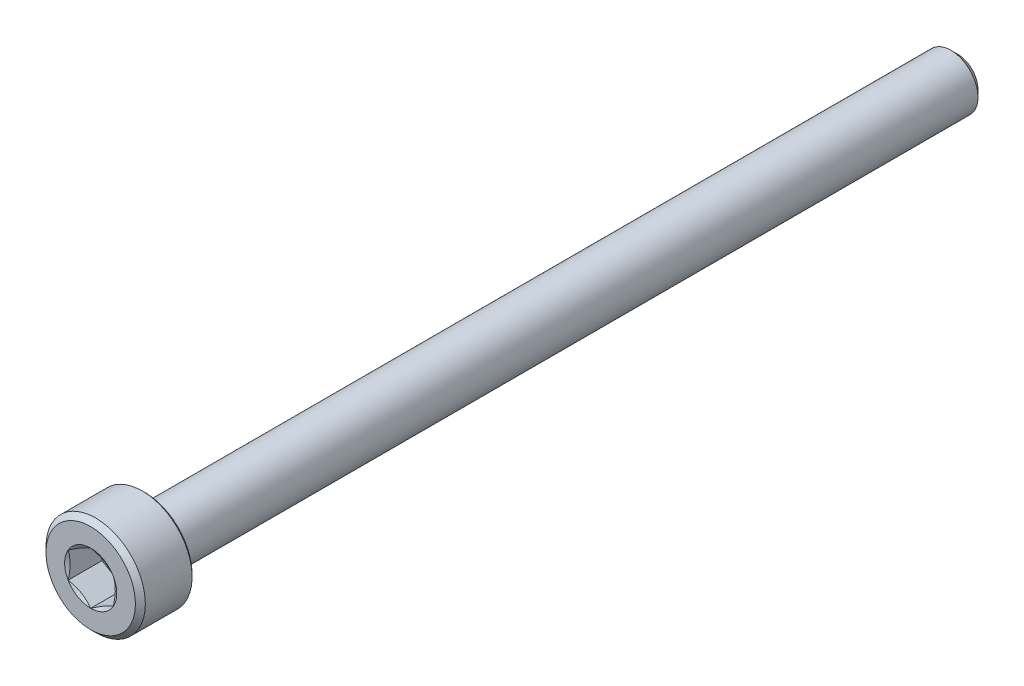
ISO-10303-21;
HEADER;
FILE_DESCRIPTION(('STEP AP214'),'2;1');
FILE_NAME('part.step','',(''),(''),'','','');
FILE_SCHEMA(('AUTOMOTIVE_DESIGN { 1 0 10303 214 1 1 1 1 }'));
ENDSEC;
DATA;
#1=APPLICATION_CONTEXT('core data for automotive mechanical design processes');
#2=APPLICATION_PROTOCOL_DEFINITION('international standard','automotive_design',2000,#1);
#3=PRODUCT_CONTEXT('',#1,'mechanical');
#4=PRODUCT('Part','Part','',(#3));
#5=PRODUCT_RELATED_PRODUCT_CATEGORY('part','',(#4));
#6=PRODUCT_DEFINITION_FORMATION('','',#4);
#7=PRODUCT_DEFINITION_CONTEXT('part definition',#1,'design');
#8=PRODUCT_DEFINITION('design','',#6,#7);
#9=PRODUCT_DEFINITION_SHAPE('','',#8);
#10=(LENGTH_UNIT() NAMED_UNIT(*) SI_UNIT(.MILLI.,.METRE.));
#11=(NAMED_UNIT(*) PLANE_ANGLE_UNIT() SI_UNIT($,.RADIAN.));
#12=(NAMED_UNIT(*) SI_UNIT($,.STERADIAN.) SOLID_ANGLE_UNIT());
#13=UNCERTAINTY_MEASURE_WITH_UNIT(LENGTH_MEASURE(1.E-05),#10,'distance_accuracy_value','');
#14=(GEOMETRIC_REPRESENTATION_CONTEXT(3) GLOBAL_UNCERTAINTY_ASSIGNED_CONTEXT((#13)) GLOBAL_UNIT_ASSIGNED_CONTEXT((#10,
#11,#12)) REPRESENTATION_CONTEXT('',''));
#15=CARTESIAN_POINT('',(0.,0.,0.));
#16=DIRECTION('',(0.,0.,1.));
#17=DIRECTION('',(1.,0.,0.));
#18=AXIS2_PLACEMENT_3D('',#15,#16,#17);
#19=CARTESIAN_POINT('',(-2.61249999999999,0.,21.));
#20=DIRECTION('',(0.,0.,-1.));
#21=DIRECTION('',(-1.,0.,0.));
#22=AXIS2_PLACEMENT_3D('',#19,#20,#21);
#23=PLANE('',#22);
#24=CARTESIAN_POINT('',(0.,0.,21.));
#25=DIRECTION('',(0.,0.,-1.));
#26=DIRECTION('',(-1.,0.,0.));
#27=AXIS2_PLACEMENT_3D('',#24,#25,#26);
#28=CIRCLE('',#27,1.5);
#29=CARTESIAN_POINT('',(-1.5,0.,21.));
#30=VERTEX_POINT('',#29);
#31=EDGE_CURVE('E12',#30,#30,#28,.T.);
#32=ORIENTED_EDGE('',*,*,#31,.F.);
#33=EDGE_LOOP('',(#32));
#34=FACE_BOUND('',#33,.T.);
#35=CARTESIAN_POINT('',(0.,0.,21.));
#36=DIRECTION('',(0.,0.,-1.));
#37=DIRECTION('',(-1.,0.,0.));
#38=AXIS2_PLACEMENT_3D('',#35,#36,#37);
#39=CIRCLE('',#38,2.61249999999999);
#40=CARTESIAN_POINT('',(-2.61249999999999,0.,21.));
#41=VERTEX_POINT('',#40);
#42=EDGE_CURVE('E260',#41,#41,#39,.T.);
#43=ORIENTED_EDGE('',*,*,#42,.T.);
#44=EDGE_LOOP('',(#43));
#45=FACE_BOUND('',#44,.T.);
#46=ADVANCED_FACE('F42',(#34,#45),#23,.T.);
#47=CARTESIAN_POINT('',(0.,0.,22.125));
#48=DIRECTION('',(0.,0.,1.));
#49=DIRECTION('',(1.,0.,0.));
#50=AXIS2_PLACEMENT_3D('',#47,#48,#49);
#51=PLANE('',#50);
#52=DIRECTION('',(-0.866025403784439,0.5,0.));
#53=VECTOR('',#52,1.);
#54=CARTESIAN_POINT('',(1.25,0.721687836487031,22.125));
#55=LINE('',#54,#53);
#56=CARTESIAN_POINT('',(1.25,0.721687836487031,22.125));
#57=VERTEX_POINT('',#56);
#58=CARTESIAN_POINT('',(0.,1.44337567297406,22.125));
#59=VERTEX_POINT('',#58);
#60=EDGE_CURVE('E108',#57,#59,#55,.T.);
#61=ORIENTED_EDGE('',*,*,#60,.T.);
#62=DIRECTION('',(-0.866025403784438,-0.5,0.));
#63=VECTOR('',#62,1.);
#64=CARTESIAN_POINT('',(0.,1.44337567297406,22.125));
#65=LINE('',#64,#63);
#66=CARTESIAN_POINT('',(-1.25,0.72168783648703,22.125));
#67=VERTEX_POINT('',#66);
#68=EDGE_CURVE('E227',#59,#67,#65,.T.);
#69=ORIENTED_EDGE('',*,*,#68,.T.);
#70=DIRECTION('',(0.,-1.,0.));
#71=VECTOR('',#70,1.);
#72=CARTESIAN_POINT('',(-1.25,0.72168783648703,22.125));
#73=LINE('',#72,#71);
#74=CARTESIAN_POINT('',(-1.25,-0.721687836487034,22.125));
#75=VERTEX_POINT('',#74);
#76=EDGE_CURVE('E230',#67,#75,#73,.T.);
#77=ORIENTED_EDGE('',*,*,#76,.T.);
#78=DIRECTION('',(0.866025403784439,-0.5,0.));
#79=VECTOR('',#78,1.);
#80=CARTESIAN_POINT('',(-1.25,-0.721687836487034,22.125));
#81=LINE('',#80,#79);
#82=CARTESIAN_POINT('',(0.,-1.44337567297407,22.125));
#83=VERTEX_POINT('',#82);
#84=EDGE_CURVE('E231',#75,#83,#81,.T.);
#85=ORIENTED_EDGE('',*,*,#84,.T.);
#86=DIRECTION('',(0.866025403784439,0.5,0.));
#87=VECTOR('',#86,1.);
#88=CARTESIAN_POINT('',(0.,-1.44337567297407,22.125));
#89=LINE('',#88,#87);
#90=CARTESIAN_POINT('',(1.25,-0.721687836487034,22.125));
#91=VERTEX_POINT('',#90);
#92=EDGE_CURVE('E236',#83,#91,#89,.T.);
#93=ORIENTED_EDGE('',*,*,#92,.T.);
#94=DIRECTION('',(0.,1.,0.));
#95=VECTOR('',#94,1.);
#96=CARTESIAN_POINT('',(1.25,-0.721687836487034,22.125));
#97=LINE('',#96,#95);
#98=EDGE_CURVE('E229',#91,#57,#97,.T.);
#99=ORIENTED_EDGE('',*,*,#98,.T.);
#100=EDGE_LOOP('',(#61,#69,#77,#85,#93,#99));
#101=FACE_BOUND('',#100,.T.);
#102=ADVANCED_FACE('F216',(#101),#51,.T.);
#103=CARTESIAN_POINT('',(0.,1.44337567297406,22.125));
#104=DIRECTION('',(-0.5,0.866025403784438,0.));
#105=DIRECTION('',(-0.866025403784439,-0.5,0.));
#106=AXIS2_PLACEMENT_3D('',#103,#104,#105);
#107=PLANE('',#106);
#108=DIRECTION('',(0.,0.,1.));
#109=VECTOR('',#108,1.);
#110=CARTESIAN_POINT('',(0.,1.44337567297406,22.125));
#111=LINE('',#110,#109);
#112=CARTESIAN_POINT('',(0.,1.44337567297406,24.));
#113=VERTEX_POINT('',#112);
#114=EDGE_CURVE('E64',#59,#113,#111,.T.);
#115=ORIENTED_EDGE('',*,*,#114,.T.);
#116=CARTESIAN_POINT('',(0.000199999999999545,1.4434911430279,24.000066674666));
#117=CARTESIAN_POINT('',(-0.0547333052317655,1.41177538446486,23.9817459147637));
#118=CARTESIAN_POINT('',(-0.11014078650024,1.37978586023939,23.9650833062006));
#119=CARTESIAN_POINT('',(-0.22191536760034,1.31525277575269,23.9359973039458));
#120=CARTESIAN_POINT('',(-0.278284454841711,1.28270806805991,23.9235842019761));
#121=CARTESIAN_POINT('',(-0.390323974086985,1.21802202146378,23.904259687636));
#122=CARTESIAN_POINT('',(-0.44597715845923,1.1858906404852,23.8972196894474));
#123=CARTESIAN_POINT('',(-0.557545653908392,1.12147653960455,23.8888124326306));
#124=CARTESIAN_POINT('',(-0.613460558937601,1.08919405413422,23.8874382152047));
#125=CARTESIAN_POINT('',(-0.717957921181725,1.02886247391297,23.8902833373679));
#126=CARTESIAN_POINT('',(-0.766555949881316,1.00080438896118,23.89380409882));
#127=CARTESIAN_POINT('',(-0.863435362173238,0.944871034195501,23.9049671126993));
#128=CARTESIAN_POINT('',(-0.911716410192163,0.916995958125018,23.9126131855727));
#129=CARTESIAN_POINT('',(-1.00879588385404,0.860947097873544,23.9317294547005));
#130=CARTESIAN_POINT('',(-1.0575820103519,0.832780414607287,23.9432807569797));
#131=CARTESIAN_POINT('',(-1.1544262522921,0.776867365453646,23.9694983146939));
#132=CARTESIAN_POINT('',(-1.20248561032696,0.749120282155138,23.9841584021391));
#133=CARTESIAN_POINT('',(-1.2502,0.721572366433192,24.000066674666));
#134=B_SPLINE_CURVE_WITH_KNOTS('',3,(#116,#117,#118,#119,#120,#121,#122,#123,#124,#125,#126,
#127,#128,#129,#130,#131,#132,#133),.UNSPECIFIED.,.F.,.F.,(4,2,2,2,2,2,2,2,4),(0.,
0.198150821029559,0.396778196315221,0.5904886173544,0.783961049317182,0.952480056398646,
1.1211553973001,1.2935743034359,1.4656542697693),.UNSPECIFIED.);
#135=CARTESIAN_POINT('',(-1.25,0.721687836487032,24.));
#136=VERTEX_POINT('',#135);
#137=EDGE_CURVE('E121',#113,#136,#134,.T.);
#138=ORIENTED_EDGE('',*,*,#137,.T.);
#139=DIRECTION('',(0.,0.,1.));
#140=VECTOR('',#139,1.);
#141=CARTESIAN_POINT('',(-1.25,0.72168783648703,22.125));
#142=LINE('',#141,#140);
#143=EDGE_CURVE('E245',#67,#136,#142,.T.);
#144=ORIENTED_EDGE('',*,*,#143,.F.);
#145=ORIENTED_EDGE('',*,*,#68,.F.);
#146=EDGE_LOOP('',(#115,#138,#144,#145));
#147=FACE_BOUND('',#146,.T.);
#148=ADVANCED_FACE('F155',(#147),#107,.F.);
#149=CARTESIAN_POINT('',(-1.25,0.72168783648703,22.125));
#150=DIRECTION('',(-1.,0.,0.));
#151=DIRECTION('',(0.,-1.,0.));
#152=AXIS2_PLACEMENT_3D('',#149,#150,#151);
#153=PLANE('',#152);
#154=ORIENTED_EDGE('',*,*,#143,.T.);
#155=CARTESIAN_POINT('',(-1.25,-1.86893140179217,24.4647941109243));
#156=CARTESIAN_POINT('',(-1.25,-1.81495202267025,24.4388968384665));
#157=CARTESIAN_POINT('',(-1.25,-1.76084125344196,24.4132686219312));
#158=CARTESIAN_POINT('',(-1.25,-1.65228662652066,24.3627027606134));
#159=CARTESIAN_POINT('',(-1.25,-1.59784271100767,24.3377652401103));
#160=CARTESIAN_POINT('',(-1.25,-1.48823931692675,24.2885939163498));
#161=CARTESIAN_POINT('',(-1.25,-1.43307750108907,24.2643652994868));
#162=CARTESIAN_POINT('',(-1.25,-1.32229188443621,24.2169950705039));
#163=CARTESIAN_POINT('',(-1.25,-1.26666810781962,24.1938534018645));
#164=CARTESIAN_POINT('',(-1.25,-1.15340083047608,24.1483546130678));
#165=CARTESIAN_POINT('',(-1.25,-1.09574254265115,24.1260338154653));
#166=CARTESIAN_POINT('',(-1.25,-0.979741082890175,24.083255476912));
#167=CARTESIAN_POINT('',(-1.25,-0.921397826164639,24.0627981694397));
#168=CARTESIAN_POINT('',(-1.25,-0.745435524772241,24.0050842376762));
#169=CARTESIAN_POINT('',(-1.25,-0.626561938132861,23.9713502149769));
#170=CARTESIAN_POINT('',(-1.25,-0.445873083681239,23.9322204068282));
#171=CARTESIAN_POINT('',(-1.25,-0.385304700192768,23.9210940606189));
#172=CARTESIAN_POINT('',(-1.25,-0.26348659206503,23.9034278522676));
#173=CARTESIAN_POINT('',(-1.25,-0.202236913753247,23.8968876801832));
#174=CARTESIAN_POINT('',(-1.25,-0.0801324468775848,23.8889987810428));
#175=CARTESIAN_POINT('',(-1.25,-0.0192817197887167,23.8875887912582));
#176=CARTESIAN_POINT('',(-1.25,0.102319232701152,23.8899161878862));
#177=CARTESIAN_POINT('',(-1.25,0.163069451645859,23.893653893026));
#178=CARTESIAN_POINT('',(-1.25,0.312961598922923,23.9088980280361));
#179=CARTESIAN_POINT('',(-1.25,0.401813055628259,23.9232612484297));
#180=CARTESIAN_POINT('',(-1.25,0.577788146583198,23.9602998495149));
#181=CARTESIAN_POINT('',(-1.25,0.664909564430747,23.9829852483541));
#182=CARTESIAN_POINT('',(-1.25,0.795209224728791,24.0217374532821));
#183=CARTESIAN_POINT('',(-1.25,0.839061001813533,24.0356229448103));
#184=CARTESIAN_POINT('',(-1.25,0.926308087473953,24.0646784153621));
#185=CARTESIAN_POINT('',(-1.25,0.969703662172459,24.0798475927664));
#186=CARTESIAN_POINT('',(-1.25,1.05609633508794,24.1112501339966));
#187=CARTESIAN_POINT('',(-1.25,1.09909350410933,24.127483304423));
#188=CARTESIAN_POINT('',(-1.25,1.18474903910479,24.1608382439108));
#189=CARTESIAN_POINT('',(-1.25,1.22740734642399,24.1779601631043));
#190=CARTESIAN_POINT('',(-1.25,1.33629459550825,24.2227614292321));
#191=CARTESIAN_POINT('',(-1.25,1.40230581092028,24.2509693835735));
#192=CARTESIAN_POINT('',(-1.25,1.53373213594212,24.3087450811585));
#193=CARTESIAN_POINT('',(-1.25,1.59914720045374,24.3383129262699));
#194=CARTESIAN_POINT('',(-1.25,1.79469680395942,24.4285769200244));
#195=CARTESIAN_POINT('',(-1.25,1.92411390982368,24.4908242731852));
#196=CARTESIAN_POINT('',(-1.25,2.18184246876936,24.6179296229027));
#197=CARTESIAN_POINT('',(-1.25,2.31015236703661,24.682790734765));
#198=CARTESIAN_POINT('',(-1.25,2.56589305685455,24.8141807455314));
#199=CARTESIAN_POINT('',(-1.25,2.69332395754888,24.8807094324427));
#200=CARTESIAN_POINT('',(-1.25,2.93557826301822,25.0085820016458));
#201=CARTESIAN_POINT('',(-1.25,3.05045639113076,25.0698225704122));
#202=CARTESIAN_POINT('',(-1.25,3.27984311898855,25.1930014800409));
#203=CARTESIAN_POINT('',(-1.25,3.39435170485538,25.2549398467261));
#204=CARTESIAN_POINT('',(-1.25,3.62279327872168,25.3791811560561));
#205=CARTESIAN_POINT('',(-1.25,3.73672698995313,25.441482770676));
#206=CARTESIAN_POINT('',(-1.25,3.96436406629495,25.5664914919315));
#207=CARTESIAN_POINT('',(-1.25,4.07806744314788,25.6291985771761));
#208=CARTESIAN_POINT('',(-1.25,4.19168806612954,25.6920543493623));
#209=B_SPLINE_CURVE_WITH_KNOTS('',3,(#155,#156,#157,#158,#159,#160,#161,#162,#163,#164,#165,
#166,#167,#168,#169,#170,#171,#172,#173,#174,#175,#176,#177,#178,#179,#180,#181,#182,#183,#184,
#185,#186,#187,#188,#189,#190,#191,#192,#193,#194,#195,#196,#197,#198,#199,#200,#201,#202,#203,
#204,#205,#206,#207,#208),.UNSPECIFIED.,.F.,.F.,(4,2,2,2,2,2,2,2,2,2,2,2,2,2,2,2,2,2,2,2,2,2,2,
2,2,2,4),(0.,0.179612926712514,0.359257964580623,0.539992735616906,0.720718098311213,
0.906167781883877,1.09164066876278,1.4615401462125,1.64614554413147,1.83073846485712,
2.0131196740194,2.19551217609307,2.46497297688035,2.73475922178117,2.87273702323329,
3.01062928909397,3.14849655975686,3.28638719597089,3.50172172546908,3.7170724117864,
4.14784491349865,4.57914698286382,5.01039449766869,5.40093821140478,5.79149642546539,
6.18106124184771,6.57060567131893),.UNSPECIFIED.);
#210=CARTESIAN_POINT('',(-1.25,-0.721687836487033,24.));
#211=VERTEX_POINT('',#210);
#212=EDGE_CURVE('E128',#136,#211,#209,.F.);
#213=ORIENTED_EDGE('',*,*,#212,.T.);
#214=DIRECTION('',(0.,0.,1.));
#215=VECTOR('',#214,1.);
#216=CARTESIAN_POINT('',(-1.25,-0.721687836487034,22.125));
#217=LINE('',#216,#215);
#218=EDGE_CURVE('E243',#75,#211,#217,.T.);
#219=ORIENTED_EDGE('',*,*,#218,.F.);
#220=ORIENTED_EDGE('',*,*,#76,.F.);
#221=EDGE_LOOP('',(#154,#213,#219,#220));
#222=FACE_BOUND('',#221,.T.);
#223=ADVANCED_FACE('F150',(#222),#153,.F.);
#224=CARTESIAN_POINT('',(-1.25,-0.721687836487034,22.125));
#225=DIRECTION('',(-0.5,-0.866025403784439,0.));
#226=DIRECTION('',(0.866025403784439,-0.5,0.));
#227=AXIS2_PLACEMENT_3D('',#224,#225,#226);
#228=PLANE('',#227);
#229=ORIENTED_EDGE('',*,*,#218,.T.);
#230=CARTESIAN_POINT('',(-1.2502,-0.721572366433196,24.000066674666));
#231=CARTESIAN_POINT('',(-1.19526669476823,-0.753288124996232,23.9817459147637));
#232=CARTESIAN_POINT('',(-1.13985921349976,-0.785277649221705,23.9650833062006));
#233=CARTESIAN_POINT('',(-1.02808463239966,-0.849810733708405,23.9359973039458));
#234=CARTESIAN_POINT('',(-0.971715545158289,-0.882355441401184,23.923584201976));
#235=CARTESIAN_POINT('',(-0.859676025913015,-0.94704148799732,23.904259687636));
#236=CARTESIAN_POINT('',(-0.804022841540769,-0.979172868975895,23.8972196894474));
#237=CARTESIAN_POINT('',(-0.692454346091607,-1.04358696985655,23.8888124326306));
#238=CARTESIAN_POINT('',(-0.636539441062399,-1.07586945532688,23.8874382152047));
#239=CARTESIAN_POINT('',(-0.532042078818274,-1.13620103554813,23.8902833373679));
#240=CARTESIAN_POINT('',(-0.483444050118683,-1.16425912049992,23.89380409882));
#241=CARTESIAN_POINT('',(-0.386564637826761,-1.2201924752656,23.9049671126993));
#242=CARTESIAN_POINT('',(-0.338283589807836,-1.24806755133608,23.9126131855727));
#243=CARTESIAN_POINT('',(-0.241204116145956,-1.30411641158755,23.9317294547005));
#244=CARTESIAN_POINT('',(-0.192417989648099,-1.33228309485381,23.9432807569797));
#245=CARTESIAN_POINT('',(-0.0955737477078969,-1.38819614400745,23.9694983146939));
#246=CARTESIAN_POINT('',(-0.0475143896730349,-1.41594322730596,23.9841584021391));
#247=CARTESIAN_POINT('',(0.000200000000000781,-1.4434911430279,24.000066674666));
#248=B_SPLINE_CURVE_WITH_KNOTS('',3,(#230,#231,#232,#233,#234,#235,#236,#237,#238,#239,#240,
#241,#242,#243,#244,#245,#246,#247),.UNSPECIFIED.,.F.,.F.,(4,2,2,2,2,2,2,2,4),(0.,
0.198150821029561,0.396778196315222,0.590488617354401,0.783961049317183,0.952480056398648,
1.1211553973001,1.2935743034359,1.4656542697693),.UNSPECIFIED.);
#249=CARTESIAN_POINT('',(0.,-1.44337567297407,24.));
#250=VERTEX_POINT('',#249);
#251=EDGE_CURVE('E131',#211,#250,#248,.T.);
#252=ORIENTED_EDGE('',*,*,#251,.T.);
#253=DIRECTION('',(0.,0.,1.));
#254=VECTOR('',#253,1.);
#255=CARTESIAN_POINT('',(0.,-1.44337567297407,22.125));
#256=LINE('',#255,#254);
#257=EDGE_CURVE('E240',#83,#250,#256,.T.);
#258=ORIENTED_EDGE('',*,*,#257,.F.);
#259=ORIENTED_EDGE('',*,*,#84,.F.);
#260=EDGE_LOOP('',(#229,#252,#258,#259));
#261=FACE_BOUND('',#260,.T.);
#262=ADVANCED_FACE('F154',(#261),#228,.F.);
#263=CARTESIAN_POINT('',(0.,-1.44337567297407,22.125));
#264=DIRECTION('',(0.5,-0.866025403784439,0.));
#265=DIRECTION('',(0.866025403784439,0.5,0.));
#266=AXIS2_PLACEMENT_3D('',#263,#264,#265);
#267=PLANE('',#266);
#268=ORIENTED_EDGE('',*,*,#257,.T.);
#269=CARTESIAN_POINT('',(-0.000199999999999969,-1.4434911430279,24.000066674666));
#270=CARTESIAN_POINT('',(0.0547333052317651,-1.41177538446487,23.9817459147637));
#271=CARTESIAN_POINT('',(0.11014078650024,-1.3797858602394,23.9650833062006));
#272=CARTESIAN_POINT('',(0.22191536760034,-1.3152527757527,23.9359973039458));
#273=CARTESIAN_POINT('',(0.278284454841711,-1.28270806805992,23.923584201976));
#274=CARTESIAN_POINT('',(0.390323974086985,-1.21802202146378,23.904259687636));
#275=CARTESIAN_POINT('',(0.44597715845923,-1.18589064048521,23.8972196894474));
#276=CARTESIAN_POINT('',(0.557545653908392,-1.12147653960455,23.8888124326306));
#277=CARTESIAN_POINT('',(0.613460558937601,-1.08919405413422,23.8874382152047));
#278=CARTESIAN_POINT('',(0.717957921181726,-1.02886247391297,23.8902833373679));
#279=CARTESIAN_POINT('',(0.766555949881316,-1.00080438896118,23.89380409882));
#280=CARTESIAN_POINT('',(0.863435362173239,-0.944871034195505,23.9049671126993));
#281=CARTESIAN_POINT('',(0.911716410192163,-0.916995958125021,23.9126131855727));
#282=CARTESIAN_POINT('',(1.00879588385404,-0.860947097873548,23.9317294547005));
#283=CARTESIAN_POINT('',(1.0575820103519,-0.832780414607291,23.9432807569797));
#284=CARTESIAN_POINT('',(1.1544262522921,-0.77686736545365,23.9694983146939));
#285=CARTESIAN_POINT('',(1.20248561032696,-0.749120282155142,23.9841584021391));
#286=CARTESIAN_POINT('',(1.2502,-0.721572366433196,24.000066674666));
#287=B_SPLINE_CURVE_WITH_KNOTS('',3,(#269,#270,#271,#272,#273,#274,#275,#276,#277,#278,#279,
#280,#281,#282,#283,#284,#285,#286),.UNSPECIFIED.,.F.,.F.,(4,2,2,2,2,2,2,2,4),(0.,
0.19815082102956,0.396778196315222,0.590488617354401,0.783961049317183,0.952480056398647,
1.1211553973001,1.2935743034359,1.4656542697693),.UNSPECIFIED.);
#288=CARTESIAN_POINT('',(1.25,-0.721687836487034,24.));
#289=VERTEX_POINT('',#288);
#290=EDGE_CURVE('E116',#250,#289,#287,.T.);
#291=ORIENTED_EDGE('',*,*,#290,.T.);
#292=DIRECTION('',(0.,0.,1.));
#293=VECTOR('',#292,1.);
#294=CARTESIAN_POINT('',(1.25,-0.721687836487034,22.125));
#295=LINE('',#294,#293);
#296=EDGE_CURVE('E114',#91,#289,#295,.T.);
#297=ORIENTED_EDGE('',*,*,#296,.F.);
#298=ORIENTED_EDGE('',*,*,#92,.F.);
#299=EDGE_LOOP('',(#268,#291,#297,#298));
#300=FACE_BOUND('',#299,.T.);
#301=ADVANCED_FACE('F161',(#300),#267,.F.);
#302=CARTESIAN_POINT('',(1.25,-0.721687836487034,22.125));
#303=DIRECTION('',(1.,0.,0.));
#304=DIRECTION('',(0.,0.,-1.));
#305=AXIS2_PLACEMENT_3D('',#302,#303,#304);
#306=PLANE('',#305);
#307=ORIENTED_EDGE('',*,*,#296,.T.);
#308=CARTESIAN_POINT('',(1.25,-1.86893140179217,24.4647941109243));
#309=CARTESIAN_POINT('',(1.25,-1.81495202267025,24.4388968384665));
#310=CARTESIAN_POINT('',(1.25,-1.76084125344196,24.4132686219312));
#311=CARTESIAN_POINT('',(1.25,-1.65228662652066,24.3627027606134));
#312=CARTESIAN_POINT('',(1.25,-1.59784271100767,24.3377652401103));
#313=CARTESIAN_POINT('',(1.25,-1.48823931692675,24.2885939163498));
#314=CARTESIAN_POINT('',(1.25,-1.43307750108907,24.2643652994868));
#315=CARTESIAN_POINT('',(1.25,-1.32229188443621,24.2169950705039));
#316=CARTESIAN_POINT('',(1.25,-1.26666810781962,24.1938534018645));
#317=CARTESIAN_POINT('',(1.25,-1.15340083047608,24.1483546130678));
#318=CARTESIAN_POINT('',(1.25,-1.09574254265115,24.1260338154653));
#319=CARTESIAN_POINT('',(1.25,-0.979741082890175,24.083255476912));
#320=CARTESIAN_POINT('',(1.25,-0.921397826164639,24.0627981694397));
#321=CARTESIAN_POINT('',(1.25,-0.745435524772241,24.0050842376762));
#322=CARTESIAN_POINT('',(1.25,-0.626561938132861,23.9713502149769));
#323=CARTESIAN_POINT('',(1.25,-0.445873083681239,23.9322204068282));
#324=CARTESIAN_POINT('',(1.25,-0.385304700192768,23.9210940606189));
#325=CARTESIAN_POINT('',(1.25,-0.26348659206503,23.9034278522676));
#326=CARTESIAN_POINT('',(1.25,-0.202236913753247,23.8968876801832));
#327=CARTESIAN_POINT('',(1.25,-0.0801324468775847,23.8889987810428));
#328=CARTESIAN_POINT('',(1.25,-0.0192817197887163,23.8875887912582));
#329=CARTESIAN_POINT('',(1.25,0.102319232701152,23.8899161878862));
#330=CARTESIAN_POINT('',(1.25,0.16306945164586,23.893653893026));
#331=CARTESIAN_POINT('',(1.25,0.312961598922924,23.9088980280361));
#332=CARTESIAN_POINT('',(1.25,0.40181305562826,23.9232612484297));
#333=CARTESIAN_POINT('',(1.25,0.577788146583198,23.9602998495149));
#334=CARTESIAN_POINT('',(1.25,0.664909564430748,23.9829852483541));
#335=CARTESIAN_POINT('',(1.25,0.795209224728792,24.0217374532821));
#336=CARTESIAN_POINT('',(1.25,0.839061001813534,24.0356229448103));
#337=CARTESIAN_POINT('',(1.25,0.926308087473953,24.0646784153621));
#338=CARTESIAN_POINT('',(1.25,0.96970366217246,24.0798475927664));
#339=CARTESIAN_POINT('',(1.25,1.05609633508794,24.1112501339966));
#340=CARTESIAN_POINT('',(1.25,1.09909350410933,24.127483304423));
#341=CARTESIAN_POINT('',(1.25,1.1847490391048,24.1608382439108));
#342=CARTESIAN_POINT('',(1.25,1.22740734642399,24.1779601631043));
#343=CARTESIAN_POINT('',(1.25,1.33629459550825,24.2227614292321));
#344=CARTESIAN_POINT('',(1.25,1.40230581092028,24.2509693835735));
#345=CARTESIAN_POINT('',(1.25,1.53373213594212,24.3087450811585));
#346=CARTESIAN_POINT('',(1.25,1.59914720045374,24.3383129262699));
#347=CARTESIAN_POINT('',(1.25,1.79469680395942,24.4285769200244));
#348=CARTESIAN_POINT('',(1.25,1.92411390982368,24.4908242731852));
#349=CARTESIAN_POINT('',(1.25,2.18184246876936,24.6179296229027));
#350=CARTESIAN_POINT('',(1.25,2.31015236703661,24.682790734765));
#351=CARTESIAN_POINT('',(1.25,2.56589305685455,24.8141807455314));
#352=CARTESIAN_POINT('',(1.25,2.69332395754888,24.8807094324427));
#353=CARTESIAN_POINT('',(1.25,2.93557826301822,25.0085820016458));
#354=CARTESIAN_POINT('',(1.25,3.05045639113076,25.0698225704122));
#355=CARTESIAN_POINT('',(1.25,3.27984311898855,25.1930014800409));
#356=CARTESIAN_POINT('',(1.25,3.39435170485538,25.2549398467262));
#357=CARTESIAN_POINT('',(1.25,3.62279327872168,25.3791811560561));
#358=CARTESIAN_POINT('',(1.25,3.73672698995313,25.441482770676));
#359=CARTESIAN_POINT('',(1.25,3.96436406629495,25.5664914919315));
#360=CARTESIAN_POINT('',(1.25,4.07806744314788,25.6291985771761));
#361=CARTESIAN_POINT('',(1.25,4.19168806612954,25.6920543493623));
#362=B_SPLINE_CURVE_WITH_KNOTS('',3,(#308,#309,#310,#311,#312,#313,#314,#315,#316,#317,#318,
#319,#320,#321,#322,#323,#324,#325,#326,#327,#328,#329,#330,#331,#332,#333,#334,#335,#336,#337,
#338,#339,#340,#341,#342,#343,#344,#345,#346,#347,#348,#349,#350,#351,#352,#353,#354,#355,#356,
#357,#358,#359,#360,#361),.UNSPECIFIED.,.F.,.F.,(4,2,2,2,2,2,2,2,2,2,2,2,2,2,2,2,2,2,2,2,2,2,2,
2,2,2,4),(0.,0.179612926712516,0.359257964580625,0.539992735616909,0.720718098311215,
0.906167781883879,1.09164066876279,1.4615401462125,1.64614554413147,1.83073846485713,
2.01311967401941,2.19551217609307,2.46497297688035,2.73475922178117,2.87273702323329,
3.01062928909397,3.14849655975687,3.28638719597089,3.50172172546908,3.7170724117864,
4.14784491349865,4.57914698286382,5.01039449766869,5.40093821140478,5.79149642546539,
6.18106124184772,6.57060567131893),.UNSPECIFIED.);
#363=CARTESIAN_POINT('',(1.25,0.721687836487028,24.));
#364=VERTEX_POINT('',#363);
#365=EDGE_CURVE('E100',#289,#364,#362,.T.);
#366=ORIENTED_EDGE('',*,*,#365,.T.);
#367=DIRECTION('',(0.,0.,1.));
#368=VECTOR('',#367,1.);
#369=CARTESIAN_POINT('',(1.25,0.721687836487031,22.125));
#370=LINE('',#369,#368);
#371=EDGE_CURVE('E113',#57,#364,#370,.T.);
#372=ORIENTED_EDGE('',*,*,#371,.F.);
#373=ORIENTED_EDGE('',*,*,#98,.F.);
#374=EDGE_LOOP('',(#307,#366,#372,#373));
#375=FACE_BOUND('',#374,.T.);
#376=ADVANCED_FACE('F111',(#375),#306,.F.);
#377=CARTESIAN_POINT('',(1.25,0.721687836487031,22.125));
#378=DIRECTION('',(0.5,0.866025403784439,0.));
#379=DIRECTION('',(-0.866025403784439,0.5,0.));
#380=AXIS2_PLACEMENT_3D('',#377,#378,#379);
#381=PLANE('',#380);
#382=ORIENTED_EDGE('',*,*,#371,.T.);
#383=CARTESIAN_POINT('',(1.2502,0.721572366433193,24.000066674666));
#384=CARTESIAN_POINT('',(1.19526669476823,0.753288124996229,23.9817459147637));
#385=CARTESIAN_POINT('',(1.13985921349976,0.785277649221701,23.9650833062006));
#386=CARTESIAN_POINT('',(1.02808463239966,0.849810733708402,23.9359973039458));
#387=CARTESIAN_POINT('',(0.97171554515829,0.88235544140118,23.9235842019761));
#388=CARTESIAN_POINT('',(0.859676025913015,0.947041487997316,23.904259687636));
#389=CARTESIAN_POINT('',(0.80402284154077,0.979172868975891,23.8972196894474));
#390=CARTESIAN_POINT('',(0.692454346091608,1.04358696985655,23.8888124326306));
#391=CARTESIAN_POINT('',(0.636539441062399,1.07586945532687,23.8874382152047));
#392=CARTESIAN_POINT('',(0.532042078818275,1.13620103554812,23.8902833373679));
#393=CARTESIAN_POINT('',(0.483444050118684,1.16425912049992,23.89380409882));
#394=CARTESIAN_POINT('',(0.386564637826761,1.22019247526559,23.9049671126993));
#395=CARTESIAN_POINT('',(0.338283589807836,1.24806755133608,23.9126131855727));
#396=CARTESIAN_POINT('',(0.241204116145956,1.30411641158755,23.9317294547005));
#397=CARTESIAN_POINT('',(0.1924179896481,1.33228309485381,23.9432807569797));
#398=CARTESIAN_POINT('',(0.0955737477078973,1.38819614400745,23.9694983146939));
#399=CARTESIAN_POINT('',(0.0475143896730352,1.41594322730595,23.9841584021391));
#400=CARTESIAN_POINT('',(-0.00020000000000046,1.4434911430279,24.000066674666));
#401=B_SPLINE_CURVE_WITH_KNOTS('',3,(#383,#384,#385,#386,#387,#388,#389,#390,#391,#392,#393,
#394,#395,#396,#397,#398,#399,#400),.UNSPECIFIED.,.F.,.F.,(4,2,2,2,2,2,2,2,4),(0.,
0.198150821029558,0.39677819631522,0.5904886173544,0.783961049317182,0.952480056398646,
1.1211553973001,1.2935743034359,1.4656542697693),.UNSPECIFIED.);
#402=EDGE_CURVE('E105',#364,#113,#401,.T.);
#403=ORIENTED_EDGE('',*,*,#402,.T.);
#404=ORIENTED_EDGE('',*,*,#114,.F.);
#405=ORIENTED_EDGE('',*,*,#60,.F.);
#406=EDGE_LOOP('',(#382,#403,#404,#405));
#407=FACE_BOUND('',#406,.T.);
#408=ADVANCED_FACE('F118',(#407),#381,.F.);
#409=CARTESIAN_POINT('',(0.,0.,24.));
#410=DIRECTION('',(0.,0.,1.));
#411=DIRECTION('',(1.,0.,0.));
#412=AXIS2_PLACEMENT_3D('',#409,#410,#411);
#413=CONICAL_SURFACE('',#412,1.44337567297406,1.0471975511966);
#414=CARTESIAN_POINT('',(0.,0.,24.));
#415=DIRECTION('',(0.,0.,1.));
#416=DIRECTION('',(1.,0.,0.));
#417=AXIS2_PLACEMENT_3D('',#414,#415,#416);
#418=CIRCLE('',#417,1.44337567297406);
#419=EDGE_CURVE('E127',#113,#136,#418,.T.);
#420=ORIENTED_EDGE('',*,*,#419,.T.);
#421=ORIENTED_EDGE('',*,*,#137,.F.);
#422=EDGE_LOOP('',(#420,#421));
#423=FACE_BOUND('',#422,.T.);
#424=ADVANCED_FACE('F185',(#423),#413,.F.);
#425=EDGE_CURVE('E129',#136,#211,#418,.T.);
#426=ORIENTED_EDGE('',*,*,#425,.T.);
#427=ORIENTED_EDGE('',*,*,#212,.F.);
#428=EDGE_LOOP('',(#426,#427));
#429=FACE_BOUND('',#428,.T.);
#430=ADVANCED_FACE('F296',(#429),#413,.F.);
#431=EDGE_CURVE('E285',#211,#250,#418,.T.);
#432=ORIENTED_EDGE('',*,*,#431,.T.);
#433=ORIENTED_EDGE('',*,*,#251,.F.);
#434=EDGE_LOOP('',(#432,#433));
#435=FACE_BOUND('',#434,.T.);
#436=ADVANCED_FACE('F294',(#435),#413,.F.);
#437=EDGE_CURVE('E104',#250,#289,#418,.T.);
#438=ORIENTED_EDGE('',*,*,#437,.T.);
#439=ORIENTED_EDGE('',*,*,#290,.F.);
#440=EDGE_LOOP('',(#438,#439));
#441=FACE_BOUND('',#440,.T.);
#442=ADVANCED_FACE('F291',(#441),#413,.F.);
#443=EDGE_CURVE('E50',#289,#364,#418,.T.);
#444=ORIENTED_EDGE('',*,*,#443,.T.);
#445=ORIENTED_EDGE('',*,*,#365,.F.);
#446=EDGE_LOOP('',(#444,#445));
#447=FACE_BOUND('',#446,.T.);
#448=ADVANCED_FACE('F98',(#447),#413,.F.);
#449=EDGE_CURVE('E45',#364,#113,#418,.T.);
#450=ORIENTED_EDGE('',*,*,#449,.T.);
#451=ORIENTED_EDGE('',*,*,#402,.F.);
#452=EDGE_LOOP('',(#450,#451));
#453=FACE_BOUND('',#452,.T.);
#454=ADVANCED_FACE('F106',(#453),#413,.F.);
#455=CARTESIAN_POINT('',(0.,2.74999999999999,24.));
#456=DIRECTION('',(0.,0.,1.));
#457=DIRECTION('',(1.,0.,0.));
#458=AXIS2_PLACEMENT_3D('',#455,#456,#457);
#459=PLANE('',#458);
#460=CARTESIAN_POINT('',(0.,0.,24.));
#461=DIRECTION('',(0.,0.,1.));
#462=DIRECTION('',(1.,0.,0.));
#463=AXIS2_PLACEMENT_3D('',#460,#461,#462);
#464=CIRCLE('',#463,2.475);
#465=CARTESIAN_POINT('',(2.475,0.,24.));
#466=VERTEX_POINT('',#465);
#467=EDGE_CURVE('E257',#466,#466,#464,.T.);
#468=ORIENTED_EDGE('',*,*,#467,.T.);
#469=EDGE_LOOP('',(#468));
#470=FACE_BOUND('',#469,.T.);
#471=ORIENTED_EDGE('',*,*,#449,.F.);
#472=ORIENTED_EDGE('',*,*,#443,.F.);
#473=ORIENTED_EDGE('',*,*,#437,.F.);
#474=ORIENTED_EDGE('',*,*,#431,.F.);
#475=ORIENTED_EDGE('',*,*,#425,.F.);
#476=ORIENTED_EDGE('',*,*,#419,.F.);
#477=EDGE_LOOP('',(#471,#472,#473,#474,#475,#476));
#478=FACE_BOUND('',#477,.T.);
#479=ADVANCED_FACE('F124',(#470,#478),#459,.T.);
#480=CARTESIAN_POINT('',(0.,0.,23.725));
#481=DIRECTION('',(0.,0.,-1.));
#482=DIRECTION('',(-1.,0.,0.));
#483=AXIS2_PLACEMENT_3D('',#480,#481,#482);
#484=CONICAL_SURFACE('',#483,2.75,0.785398163397451);
#485=ORIENTED_EDGE('',*,*,#467,.F.);
#486=EDGE_LOOP('',(#485));
#487=FACE_BOUND('',#486,.T.);
#488=CARTESIAN_POINT('',(0.,0.,23.725));
#489=DIRECTION('',(0.,0.,1.));
#490=DIRECTION('',(1.,0.,0.));
#491=AXIS2_PLACEMENT_3D('',#488,#489,#490);
#492=CIRCLE('',#491,2.75);
#493=CARTESIAN_POINT('',(2.75,0.,23.725));
#494=VERTEX_POINT('',#493);
#495=EDGE_CURVE('E254',#494,#494,#492,.F.);
#496=ORIENTED_EDGE('',*,*,#495,.F.);
#497=EDGE_LOOP('',(#496));
#498=FACE_BOUND('',#497,.T.);
#499=ADVANCED_FACE('F190',(#487,#498),#484,.T.);
#500=CARTESIAN_POINT('',(0.,0.,-24.));
#501=DIRECTION('',(0.,0.,-1.));
#502=DIRECTION('',(-1.,0.,0.));
#503=AXIS2_PLACEMENT_3D('',#500,#501,#502);
#504=CYLINDRICAL_SURFACE('',#503,2.75);
#505=CARTESIAN_POINT('',(0.,0.,21.1375));
#506=DIRECTION('',(0.,0.,-1.));
#507=DIRECTION('',(-1.,0.,0.));
#508=AXIS2_PLACEMENT_3D('',#505,#506,#507);
#509=CIRCLE('',#508,2.75);
#510=CARTESIAN_POINT('',(-2.75,0.,21.1375));
#511=VERTEX_POINT('',#510);
#512=EDGE_CURVE('E263',#511,#511,#509,.F.);
#513=ORIENTED_EDGE('',*,*,#512,.T.);
#514=EDGE_LOOP('',(#513));
#515=FACE_BOUND('',#514,.T.);
#516=ORIENTED_EDGE('',*,*,#495,.T.);
#517=EDGE_LOOP('',(#516));
#518=FACE_BOUND('',#517,.T.);
#519=ADVANCED_FACE('F186',(#515,#518),#504,.T.);
#520=CARTESIAN_POINT('',(0.,0.,21.));
#521=DIRECTION('',(0.,0.,1.));
#522=DIRECTION('',(1.,0.,0.));
#523=AXIS2_PLACEMENT_3D('',#520,#521,#522);
#524=CONICAL_SURFACE('',#523,2.61249999999999,0.785398163397455);
#525=ORIENTED_EDGE('',*,*,#512,.F.);
#526=EDGE_LOOP('',(#525));
#527=FACE_BOUND('',#526,.T.);
#528=ORIENTED_EDGE('',*,*,#42,.F.);
#529=EDGE_LOOP('',(#528));
#530=FACE_BOUND('',#529,.T.);
#531=ADVANCED_FACE('F189',(#527,#530),#524,.T.);
#532=CARTESIAN_POINT('',(0.,0.,-24.));
#533=DIRECTION('',(0.,0.,-1.));
#534=DIRECTION('',(-1.,0.,0.));
#535=AXIS2_PLACEMENT_3D('',#532,#533,#534);
#536=CYLINDRICAL_SURFACE('',#535,1.5);
#537=CARTESIAN_POINT('',(0.,0.,-23.625));
#538=DIRECTION('',(0.,0.,-1.));
#539=DIRECTION('',(-1.,0.,0.));
#540=AXIS2_PLACEMENT_3D('',#537,#538,#539);
#541=CIRCLE('',#540,1.5);
#542=CARTESIAN_POINT('',(-1.5,0.,-23.625));
#543=VERTEX_POINT('',#542);
#544=EDGE_CURVE('E269',#543,#543,#541,.T.);
#545=ORIENTED_EDGE('',*,*,#544,.F.);
#546=EDGE_LOOP('',(#545));
#547=FACE_BOUND('',#546,.T.);
#548=ORIENTED_EDGE('',*,*,#31,.T.);
#549=EDGE_LOOP('',(#548));
#550=FACE_BOUND('',#549,.T.);
#551=ADVANCED_FACE('F200',(#547,#550),#536,.T.);
#552=CARTESIAN_POINT('',(0.,0.,-23.625));
#553=DIRECTION('',(0.,0.,1.));
#554=DIRECTION('',(1.,0.,0.));
#555=AXIS2_PLACEMENT_3D('',#552,#553,#554);
#556=CONICAL_SURFACE('',#555,1.5,0.785398163397447);
#557=CARTESIAN_POINT('',(0.,0.,-24.));
#558=DIRECTION('',(0.,0.,-1.));
#559=DIRECTION('',(-1.,0.,0.));
#560=AXIS2_PLACEMENT_3D('',#557,#558,#559);
#561=CIRCLE('',#560,1.125);
#562=CARTESIAN_POINT('',(-1.125,0.,-24.));
#563=VERTEX_POINT('',#562);
#564=EDGE_CURVE('E265',#563,#563,#561,.T.);
#565=ORIENTED_EDGE('',*,*,#564,.F.);
#566=EDGE_LOOP('',(#565));
#567=FACE_BOUND('',#566,.T.);
#568=ORIENTED_EDGE('',*,*,#544,.T.);
#569=EDGE_LOOP('',(#568));
#570=FACE_BOUND('',#569,.T.);
#571=ADVANCED_FACE('F204',(#567,#570),#556,.T.);
#572=CARTESIAN_POINT('',(0.,1.49999999999999,-24.));
#573=DIRECTION('',(0.,0.,-1.));
#574=DIRECTION('',(-1.,0.,0.));
#575=AXIS2_PLACEMENT_3D('',#572,#573,#574);
#576=PLANE('',#575);
#577=ORIENTED_EDGE('',*,*,#564,.T.);
#578=EDGE_LOOP('',(#577));
#579=FACE_BOUND('',#578,.T.);
#580=ADVANCED_FACE('F206',(#579),#576,.T.);
#581=CLOSED_SHELL('',(#46,#102,#148,#223,#262,#301,#376,#408,#424,#430,#436,#442,#448,#454,#479,
#499,#519,#531,#551,#571,#580));
#582=MANIFOLD_SOLID_BREP('B2',#581);
#583=ADVANCED_BREP_SHAPE_REPRESENTATION('',(#18,#582),#14);
#584=SHAPE_DEFINITION_REPRESENTATION(#9,#583);
ENDSEC;
END-ISO-10303-21;
